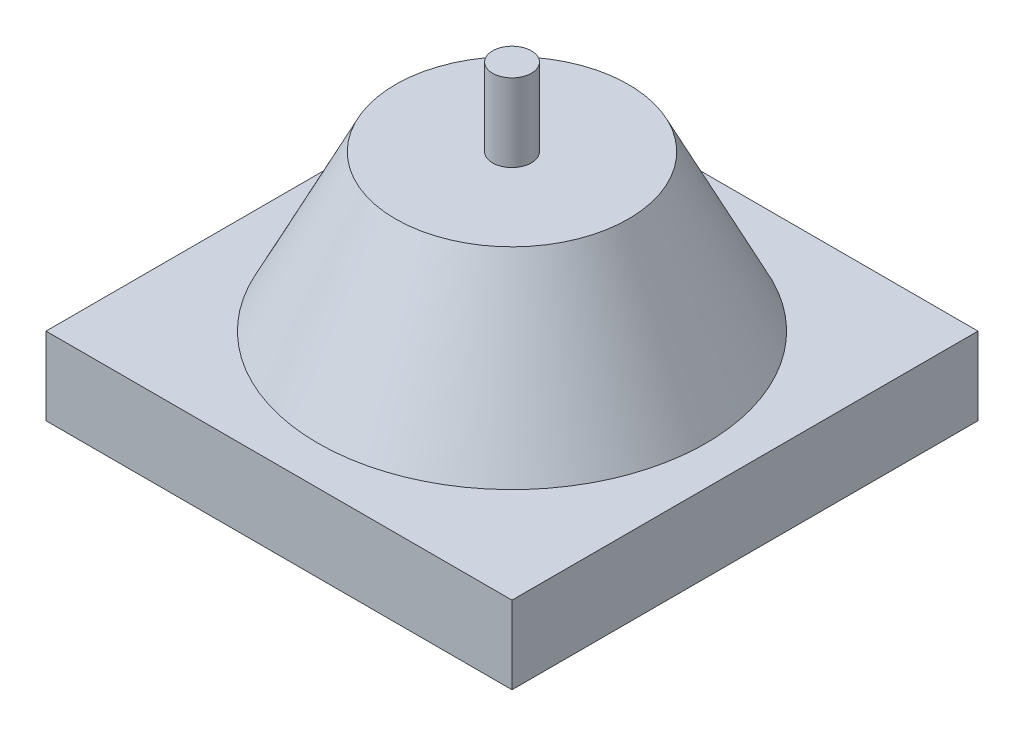
ISO-10303-21;
HEADER;
FILE_DESCRIPTION(('STEP AP214'),'2;1');
FILE_NAME('part.step','',(''),(''),'','','');
FILE_SCHEMA(('AUTOMOTIVE_DESIGN { 1 0 10303 214 1 1 1 1 }'));
ENDSEC;
DATA;
#1=APPLICATION_CONTEXT('core data for automotive mechanical design processes');
#2=APPLICATION_PROTOCOL_DEFINITION('international standard','automotive_design',2000,#1);
#3=PRODUCT_CONTEXT('',#1,'mechanical');
#4=PRODUCT('Part','Part','',(#3));
#5=PRODUCT_RELATED_PRODUCT_CATEGORY('part','',(#4));
#6=PRODUCT_DEFINITION_FORMATION('','',#4);
#7=PRODUCT_DEFINITION_CONTEXT('part definition',#1,'design');
#8=PRODUCT_DEFINITION('design','',#6,#7);
#9=PRODUCT_DEFINITION_SHAPE('','',#8);
#10=(LENGTH_UNIT() NAMED_UNIT(*) SI_UNIT(.MILLI.,.METRE.));
#11=(NAMED_UNIT(*) PLANE_ANGLE_UNIT() SI_UNIT($,.RADIAN.));
#12=(NAMED_UNIT(*) SI_UNIT($,.STERADIAN.) SOLID_ANGLE_UNIT());
#13=UNCERTAINTY_MEASURE_WITH_UNIT(LENGTH_MEASURE(1.E-05),#10,'distance_accuracy_value','');
#14=(GEOMETRIC_REPRESENTATION_CONTEXT(3) GLOBAL_UNCERTAINTY_ASSIGNED_CONTEXT((#13)) GLOBAL_UNIT_ASSIGNED_CONTEXT((#10,
#11,#12)) REPRESENTATION_CONTEXT('',''));
#15=CARTESIAN_POINT('',(0.,0.,0.));
#16=DIRECTION('',(0.,0.,1.));
#17=DIRECTION('',(1.,0.,0.));
#18=AXIS2_PLACEMENT_3D('',#15,#16,#17);
#19=CARTESIAN_POINT('',(0.,50.8,0.));
#20=DIRECTION('',(0.,1.,0.));
#21=DIRECTION('',(0.,0.,1.));
#22=AXIS2_PLACEMENT_3D('',#19,#20,#21);
#23=PLANE('',#22);
#24=CARTESIAN_POINT('',(0.,50.8,0.));
#25=DIRECTION('',(0.,1.,0.));
#26=DIRECTION('',(0.,0.,1.));
#27=AXIS2_PLACEMENT_3D('',#24,#25,#26);
#28=CIRCLE('',#27,6.35);
#29=CARTESIAN_POINT('',(0.,50.8,6.35));
#30=VERTEX_POINT('',#29);
#31=EDGE_CURVE('E12',#30,#30,#28,.T.);
#32=ORIENTED_EDGE('',*,*,#31,.F.);
#33=EDGE_LOOP('',(#32));
#34=FACE_BOUND('',#33,.T.);
#35=CARTESIAN_POINT('',(0.,50.8,0.));
#36=DIRECTION('',(0.,1.,0.));
#37=DIRECTION('',(0.,0.,1.));
#38=AXIS2_PLACEMENT_3D('',#35,#36,#37);
#39=CIRCLE('',#38,38.1);
#40=CARTESIAN_POINT('',(0.,50.8,38.1));
#41=VERTEX_POINT('',#40);
#42=EDGE_CURVE('E55',#41,#41,#39,.T.);
#43=ORIENTED_EDGE('',*,*,#42,.T.);
#44=EDGE_LOOP('',(#43));
#45=FACE_BOUND('',#44,.T.);
#46=ADVANCED_FACE('F43',(#34,#45),#23,.T.);
#47=CARTESIAN_POINT('',(0.,50.8,0.));
#48=DIRECTION('',(0.,-1.,0.));
#49=DIRECTION('',(0.,0.,-1.));
#50=AXIS2_PLACEMENT_3D('',#47,#48,#49);
#51=CONICAL_SURFACE('',#50,38.1,0.463647609000806);
#52=CARTESIAN_POINT('',(0.,0.,0.));
#53=DIRECTION('',(0.,1.,0.));
#54=DIRECTION('',(0.,0.,1.));
#55=AXIS2_PLACEMENT_3D('',#52,#53,#54);
#56=CIRCLE('',#55,63.5);
#57=CARTESIAN_POINT('',(0.,0.,63.5));
#58=VERTEX_POINT('',#57);
#59=EDGE_CURVE('E47',#58,#58,#56,.T.);
#60=ORIENTED_EDGE('',*,*,#59,.T.);
#61=EDGE_LOOP('',(#60));
#62=FACE_BOUND('',#61,.T.);
#63=ORIENTED_EDGE('',*,*,#42,.F.);
#64=EDGE_LOOP('',(#63));
#65=FACE_BOUND('',#64,.T.);
#66=ADVANCED_FACE('F166',(#62,#65),#51,.T.);
#67=CARTESIAN_POINT('',(76.2,-25.4,-76.2));
#68=DIRECTION('',(-1.,0.,0.));
#69=DIRECTION('',(0.,0.,1.));
#70=AXIS2_PLACEMENT_3D('',#67,#68,#69);
#71=PLANE('',#70);
#72=DIRECTION('',(0.,0.,1.));
#73=VECTOR('',#72,1.);
#74=CARTESIAN_POINT('',(76.2,0.,-76.2));
#75=LINE('',#74,#73);
#76=CARTESIAN_POINT('',(76.2,0.,-76.2));
#77=VERTEX_POINT('',#76);
#78=CARTESIAN_POINT('',(76.2,0.,76.2));
#79=VERTEX_POINT('',#78);
#80=EDGE_CURVE('E119',#77,#79,#75,.T.);
#81=ORIENTED_EDGE('',*,*,#80,.T.);
#82=DIRECTION('',(0.,1.,0.));
#83=VECTOR('',#82,1.);
#84=CARTESIAN_POINT('',(76.2,-25.4,76.2));
#85=LINE('',#84,#83);
#86=CARTESIAN_POINT('',(76.2,-25.4,76.2));
#87=VERTEX_POINT('',#86);
#88=EDGE_CURVE('E108',#87,#79,#85,.T.);
#89=ORIENTED_EDGE('',*,*,#88,.F.);
#90=DIRECTION('',(0.,0.,1.));
#91=VECTOR('',#90,1.);
#92=CARTESIAN_POINT('',(76.2,-25.4,-76.2));
#93=LINE('',#92,#91);
#94=CARTESIAN_POINT('',(76.2,-25.4,-76.2));
#95=VERTEX_POINT('',#94);
#96=EDGE_CURVE('E100',#95,#87,#93,.T.);
#97=ORIENTED_EDGE('',*,*,#96,.F.);
#98=DIRECTION('',(0.,1.,0.));
#99=VECTOR('',#98,1.);
#100=CARTESIAN_POINT('',(76.2,-25.4,-76.2));
#101=LINE('',#100,#99);
#102=EDGE_CURVE('E115',#95,#77,#101,.T.);
#103=ORIENTED_EDGE('',*,*,#102,.T.);
#104=EDGE_LOOP('',(#81,#89,#97,#103));
#105=FACE_BOUND('',#104,.T.);
#106=ADVANCED_FACE('F164',(#105),#71,.F.);
#107=CARTESIAN_POINT('',(-76.2,-25.4,76.2));
#108=DIRECTION('',(0.,0.,-1.));
#109=DIRECTION('',(-1.,0.,0.));
#110=AXIS2_PLACEMENT_3D('',#107,#108,#109);
#111=PLANE('',#110);
#112=DIRECTION('',(-1.,0.,0.));
#113=VECTOR('',#112,1.);
#114=CARTESIAN_POINT('',(-76.2,0.,76.2));
#115=LINE('',#114,#113);
#116=CARTESIAN_POINT('',(-76.2,0.,76.2));
#117=VERTEX_POINT('',#116);
#118=EDGE_CURVE('E106',#79,#117,#115,.T.);
#119=ORIENTED_EDGE('',*,*,#118,.T.);
#120=DIRECTION('',(0.,1.,0.));
#121=VECTOR('',#120,1.);
#122=CARTESIAN_POINT('',(-76.2,-25.4,76.2));
#123=LINE('',#122,#121);
#124=CARTESIAN_POINT('',(-76.2,-25.4,76.2));
#125=VERTEX_POINT('',#124);
#126=EDGE_CURVE('E104',#125,#117,#123,.T.);
#127=ORIENTED_EDGE('',*,*,#126,.F.);
#128=DIRECTION('',(-1.,0.,0.));
#129=VECTOR('',#128,1.);
#130=CARTESIAN_POINT('',(-76.2,-25.4,76.2));
#131=LINE('',#130,#129);
#132=EDGE_CURVE('E95',#87,#125,#131,.T.);
#133=ORIENTED_EDGE('',*,*,#132,.F.);
#134=ORIENTED_EDGE('',*,*,#88,.T.);
#135=EDGE_LOOP('',(#119,#127,#133,#134));
#136=FACE_BOUND('',#135,.T.);
#137=ADVANCED_FACE('F105',(#136),#111,.F.);
#138=CARTESIAN_POINT('',(-76.2,-25.4,-76.2));
#139=DIRECTION('',(1.,0.,0.));
#140=DIRECTION('',(0.,0.,-1.));
#141=AXIS2_PLACEMENT_3D('',#138,#139,#140);
#142=PLANE('',#141);
#143=DIRECTION('',(0.,0.,-1.));
#144=VECTOR('',#143,1.);
#145=CARTESIAN_POINT('',(-76.2,0.,-76.2));
#146=LINE('',#145,#144);
#147=CARTESIAN_POINT('',(-76.2,0.,-76.2));
#148=VERTEX_POINT('',#147);
#149=EDGE_CURVE('E81',#117,#148,#146,.T.);
#150=ORIENTED_EDGE('',*,*,#149,.T.);
#151=DIRECTION('',(0.,1.,0.));
#152=VECTOR('',#151,1.);
#153=CARTESIAN_POINT('',(-76.2,-25.4,-76.2));
#154=LINE('',#153,#152);
#155=CARTESIAN_POINT('',(-76.2,-25.4,-76.2));
#156=VERTEX_POINT('',#155);
#157=EDGE_CURVE('E109',#156,#148,#154,.T.);
#158=ORIENTED_EDGE('',*,*,#157,.F.);
#159=DIRECTION('',(0.,0.,-1.));
#160=VECTOR('',#159,1.);
#161=CARTESIAN_POINT('',(-76.2,-25.4,-76.2));
#162=LINE('',#161,#160);
#163=EDGE_CURVE('E98',#125,#156,#162,.T.);
#164=ORIENTED_EDGE('',*,*,#163,.F.);
#165=ORIENTED_EDGE('',*,*,#126,.T.);
#166=EDGE_LOOP('',(#150,#158,#164,#165));
#167=FACE_BOUND('',#166,.T.);
#168=ADVANCED_FACE('F111',(#167),#142,.F.);
#169=CARTESIAN_POINT('',(-76.2,-25.4,-76.2));
#170=DIRECTION('',(0.,0.,1.));
#171=DIRECTION('',(1.,0.,0.));
#172=AXIS2_PLACEMENT_3D('',#169,#170,#171);
#173=PLANE('',#172);
#174=DIRECTION('',(1.,0.,0.));
#175=VECTOR('',#174,1.);
#176=CARTESIAN_POINT('',(-76.2,0.,-76.2));
#177=LINE('',#176,#175);
#178=EDGE_CURVE('E87',#148,#77,#177,.T.);
#179=ORIENTED_EDGE('',*,*,#178,.T.);
#180=ORIENTED_EDGE('',*,*,#102,.F.);
#181=DIRECTION('',(1.,0.,0.));
#182=VECTOR('',#181,1.);
#183=CARTESIAN_POINT('',(-76.2,-25.4,-76.2));
#184=LINE('',#183,#182);
#185=EDGE_CURVE('E64',#156,#95,#184,.T.);
#186=ORIENTED_EDGE('',*,*,#185,.F.);
#187=ORIENTED_EDGE('',*,*,#157,.T.);
#188=EDGE_LOOP('',(#179,#180,#186,#187));
#189=FACE_BOUND('',#188,.T.);
#190=ADVANCED_FACE('F157',(#189),#173,.F.);
#191=CARTESIAN_POINT('',(0.,-25.4,0.));
#192=DIRECTION('',(0.,1.,0.));
#193=DIRECTION('',(0.,0.,1.));
#194=AXIS2_PLACEMENT_3D('',#191,#192,#193);
#195=PLANE('',#194);
#196=ORIENTED_EDGE('',*,*,#96,.T.);
#197=ORIENTED_EDGE('',*,*,#132,.T.);
#198=ORIENTED_EDGE('',*,*,#163,.T.);
#199=ORIENTED_EDGE('',*,*,#185,.T.);
#200=EDGE_LOOP('',(#196,#197,#198,#199));
#201=FACE_BOUND('',#200,.T.);
#202=ADVANCED_FACE('F96',(#201),#195,.F.);
#203=CARTESIAN_POINT('',(0.,0.,0.));
#204=DIRECTION('',(0.,1.,0.));
#205=DIRECTION('',(0.,0.,1.));
#206=AXIS2_PLACEMENT_3D('',#203,#204,#205);
#207=PLANE('',#206);
#208=ORIENTED_EDGE('',*,*,#59,.F.);
#209=EDGE_LOOP('',(#208));
#210=FACE_BOUND('',#209,.T.);
#211=ORIENTED_EDGE('',*,*,#80,.F.);
#212=ORIENTED_EDGE('',*,*,#178,.F.);
#213=ORIENTED_EDGE('',*,*,#149,.F.);
#214=ORIENTED_EDGE('',*,*,#118,.F.);
#215=EDGE_LOOP('',(#211,#212,#213,#214));
#216=FACE_BOUND('',#215,.T.);
#217=ADVANCED_FACE('F145',(#210,#216),#207,.T.);
#218=CARTESIAN_POINT('',(0.,76.2,0.));
#219=DIRECTION('',(0.,-1.,0.));
#220=DIRECTION('',(0.,0.,-1.));
#221=AXIS2_PLACEMENT_3D('',#218,#219,#220);
#222=CYLINDRICAL_SURFACE('',#221,6.35);
#223=CARTESIAN_POINT('',(0.,76.2,0.));
#224=DIRECTION('',(0.,1.,0.));
#225=DIRECTION('',(0.,0.,1.));
#226=AXIS2_PLACEMENT_3D('',#223,#224,#225);
#227=CIRCLE('',#226,6.35);
#228=CARTESIAN_POINT('',(0.,76.2,6.35));
#229=VERTEX_POINT('',#228);
#230=EDGE_CURVE('E123',#229,#229,#227,.T.);
#231=ORIENTED_EDGE('',*,*,#230,.F.);
#232=EDGE_LOOP('',(#231));
#233=FACE_BOUND('',#232,.T.);
#234=ORIENTED_EDGE('',*,*,#31,.T.);
#235=EDGE_LOOP('',(#234));
#236=FACE_BOUND('',#235,.T.);
#237=ADVANCED_FACE('F155',(#233,#236),#222,.T.);
#238=CARTESIAN_POINT('',(0.,76.2,0.));
#239=DIRECTION('',(0.,1.,0.));
#240=DIRECTION('',(0.,0.,1.));
#241=AXIS2_PLACEMENT_3D('',#238,#239,#240);
#242=PLANE('',#241);
#243=ORIENTED_EDGE('',*,*,#230,.T.);
#244=EDGE_LOOP('',(#243));
#245=FACE_BOUND('',#244,.T.);
#246=ADVANCED_FACE('F208',(#245),#242,.T.);
#247=CLOSED_SHELL('',(#46,#66,#106,#137,#168,#190,#202,#217,#237,#246));
#248=MANIFOLD_SOLID_BREP('B2',#247);
#249=ADVANCED_BREP_SHAPE_REPRESENTATION('',(#18,#248),#14);
#250=SHAPE_DEFINITION_REPRESENTATION(#9,#249);
ENDSEC;
END-ISO-10303-21;
